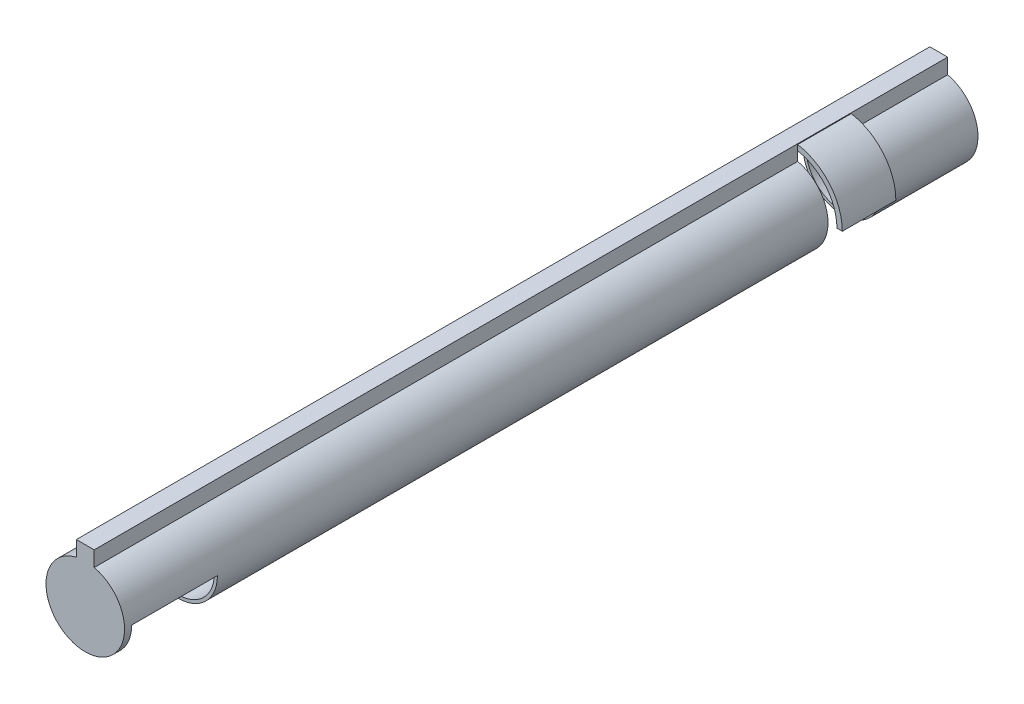
ISO-10303-21;
HEADER;
FILE_DESCRIPTION(('STEP AP214'),'2;1');
FILE_NAME('part.step','',(''),(''),'','','');
FILE_SCHEMA(('AUTOMOTIVE_DESIGN { 1 0 10303 214 1 1 1 1 }'));
ENDSEC;
DATA;
#1=APPLICATION_CONTEXT('core data for automotive mechanical design processes');
#2=APPLICATION_PROTOCOL_DEFINITION('international standard','automotive_design',2000,#1);
#3=PRODUCT_CONTEXT('',#1,'mechanical');
#4=PRODUCT('Part','Part','',(#3));
#5=PRODUCT_RELATED_PRODUCT_CATEGORY('part','',(#4));
#6=PRODUCT_DEFINITION_FORMATION('','',#4);
#7=PRODUCT_DEFINITION_CONTEXT('part definition',#1,'design');
#8=PRODUCT_DEFINITION('design','',#6,#7);
#9=PRODUCT_DEFINITION_SHAPE('','',#8);
#10=(LENGTH_UNIT() NAMED_UNIT(*) SI_UNIT(.MILLI.,.METRE.));
#11=(NAMED_UNIT(*) PLANE_ANGLE_UNIT() SI_UNIT($,.RADIAN.));
#12=(NAMED_UNIT(*) SI_UNIT($,.STERADIAN.) SOLID_ANGLE_UNIT());
#13=UNCERTAINTY_MEASURE_WITH_UNIT(LENGTH_MEASURE(1.E-05),#10,'distance_accuracy_value','');
#14=(GEOMETRIC_REPRESENTATION_CONTEXT(3) GLOBAL_UNCERTAINTY_ASSIGNED_CONTEXT((#13)) GLOBAL_UNIT_ASSIGNED_CONTEXT((#10,
#11,#12)) REPRESENTATION_CONTEXT('',''));
#15=CARTESIAN_POINT('',(0.,0.,0.));
#16=DIRECTION('',(0.,0.,1.));
#17=DIRECTION('',(1.,0.,0.));
#18=AXIS2_PLACEMENT_3D('',#15,#16,#17);
#19=CARTESIAN_POINT('',(0.,0.,213.));
#20=DIRECTION('',(0.,0.,1.));
#21=DIRECTION('',(1.,0.,0.));
#22=AXIS2_PLACEMENT_3D('',#19,#20,#21);
#23=PLANE('',#22);
#24=CARTESIAN_POINT('',(0.,0.,213.));
#25=DIRECTION('',(0.,0.,1.));
#26=DIRECTION('',(1.,0.,0.));
#27=AXIS2_PLACEMENT_3D('',#24,#25,#26);
#28=CIRCLE('',#27,6.5);
#29=CARTESIAN_POINT('',(5.50457363682691,3.45682933867876,213.));
#30=VERTEX_POINT('',#29);
#31=CARTESIAN_POINT('',(-3.45682933867876,-5.50457363682691,213.));
#32=VERTEX_POINT('',#31);
#33=EDGE_CURVE('E235',#30,#32,#28,.T.);
#34=ORIENTED_EDGE('',*,*,#33,.F.);
#35=CARTESIAN_POINT('',(12.2794334975369,7.71138852474491,213.));
#36=DIRECTION('',(0.,0.,1.));
#37=DIRECTION('',(1.,0.,0.));
#38=AXIS2_PLACEMENT_3D('',#35,#36,#37);
#39=CIRCLE('',#38,8.);
#40=CARTESIAN_POINT('',(10.15,0.,213.));
#41=VERTEX_POINT('',#40);
#42=EDGE_CURVE('E11',#30,#41,#39,.T.);
#43=ORIENTED_EDGE('',*,*,#42,.T.);
#44=CARTESIAN_POINT('',(0.,0.,213.));
#45=DIRECTION('',(0.,0.,1.));
#46=DIRECTION('',(1.,0.,0.));
#47=AXIS2_PLACEMENT_3D('',#44,#45,#46);
#48=CIRCLE('',#47,10.15);
#49=CARTESIAN_POINT('',(0.,-10.15,213.));
#50=VERTEX_POINT('',#49);
#51=EDGE_CURVE('E183',#41,#50,#48,.T.);
#52=ORIENTED_EDGE('',*,*,#51,.T.);
#53=CARTESIAN_POINT('',(-7.71138852474491,-12.2794334975369,213.));
#54=DIRECTION('',(0.,0.,1.));
#55=DIRECTION('',(1.,0.,0.));
#56=AXIS2_PLACEMENT_3D('',#53,#54,#55);
#57=CIRCLE('',#56,8.);
#58=EDGE_CURVE('E42',#50,#32,#57,.T.);
#59=ORIENTED_EDGE('',*,*,#58,.T.);
#60=EDGE_LOOP('',(#34,#43,#52,#59));
#61=FACE_BOUND('',#60,.T.);
#62=ADVANCED_FACE('F34',(#61),#23,.T.);
#63=CARTESIAN_POINT('',(0.,0.,210.));
#64=DIRECTION('',(0.,0.,-1.));
#65=DIRECTION('',(-1.,0.,0.));
#66=AXIS2_PLACEMENT_3D('',#63,#64,#65);
#67=CYLINDRICAL_SURFACE('',#66,11.);
#68=CARTESIAN_POINT('',(0.,0.,27.));
#69=DIRECTION('',(0.,0.,1.));
#70=DIRECTION('',(1.,0.,0.));
#71=AXIS2_PLACEMENT_3D('',#68,#69,#70);
#72=CIRCLE('',#71,11.);
#73=CARTESIAN_POINT('',(-2.5,10.7121426428143,27.));
#74=VERTEX_POINT('',#73);
#75=CARTESIAN_POINT('',(2.5,10.7121426428143,27.));
#76=VERTEX_POINT('',#75);
#77=EDGE_CURVE('E309',#74,#76,#72,.T.);
#78=ORIENTED_EDGE('',*,*,#77,.F.);
#79=DIRECTION('',(0.,0.,-1.));
#80=VECTOR('',#79,1.);
#81=CARTESIAN_POINT('',(-2.5,10.7121426428143,245.58678379147));
#82=LINE('',#81,#80);
#83=CARTESIAN_POINT('',(-2.5,10.7121426428143,0.));
#84=VERTEX_POINT('',#83);
#85=EDGE_CURVE('E274',#74,#84,#82,.T.);
#86=ORIENTED_EDGE('',*,*,#85,.T.);
#87=CARTESIAN_POINT('',(0.,0.,0.));
#88=DIRECTION('',(0.,0.,1.));
#89=DIRECTION('',(1.,0.,0.));
#90=AXIS2_PLACEMENT_3D('',#87,#88,#89);
#91=CIRCLE('',#90,11.);
#92=CARTESIAN_POINT('',(2.5,10.7121426428143,0.));
#93=VERTEX_POINT('',#92);
#94=EDGE_CURVE('E212',#84,#93,#91,.T.);
#95=ORIENTED_EDGE('',*,*,#94,.T.);
#96=DIRECTION('',(0.,0.,-1.));
#97=VECTOR('',#96,1.);
#98=CARTESIAN_POINT('',(2.5,10.7121426428143,245.58678379147));
#99=LINE('',#98,#97);
#100=EDGE_CURVE('E270',#76,#93,#99,.T.);
#101=ORIENTED_EDGE('',*,*,#100,.F.);
#102=EDGE_LOOP('',(#78,#86,#95,#101));
#103=FACE_BOUND('',#102,.T.);
#104=ADVANCED_FACE('F354',(#103),#67,.T.);
#105=CARTESIAN_POINT('',(0.,0.,210.));
#106=DIRECTION('',(0.,0.,-1.));
#107=DIRECTION('',(-1.,0.,0.));
#108=AXIS2_PLACEMENT_3D('',#105,#106,#107);
#109=CYLINDRICAL_SURFACE('',#108,10.15);
#110=CARTESIAN_POINT('',(0.,0.,0.));
#111=DIRECTION('',(0.,0.,1.));
#112=DIRECTION('',(1.,0.,0.));
#113=AXIS2_PLACEMENT_3D('',#110,#111,#112);
#114=CIRCLE('',#113,10.15);
#115=CARTESIAN_POINT('',(10.15,0.,0.));
#116=VERTEX_POINT('',#115);
#117=EDGE_CURVE('E205',#116,#116,#114,.T.);
#118=ORIENTED_EDGE('',*,*,#117,.F.);
#119=EDGE_LOOP('',(#118));
#120=FACE_BOUND('',#119,.T.);
#121=CARTESIAN_POINT('',(0.,0.,27.));
#122=DIRECTION('',(0.,0.,1.));
#123=DIRECTION('',(1.,0.,0.));
#124=AXIS2_PLACEMENT_3D('',#121,#122,#123);
#125=CIRCLE('',#124,10.15);
#126=CARTESIAN_POINT('',(10.15,0.,27.));
#127=VERTEX_POINT('',#126);
#128=EDGE_CURVE('E304',#127,#127,#125,.T.);
#129=ORIENTED_EDGE('',*,*,#128,.T.);
#130=EDGE_LOOP('',(#129));
#131=FACE_BOUND('',#130,.T.);
#132=ADVANCED_FACE('F359',(#120,#131),#109,.F.);
#133=DIRECTION('',(0.,0.,-1.));
#134=VECTOR('',#133,1.);
#135=CARTESIAN_POINT('',(11.,0.,237.));
#136=LINE('',#135,#134);
#137=CARTESIAN_POINT('',(11.,0.,237.));
#138=VERTEX_POINT('',#137);
#139=CARTESIAN_POINT('',(11.,0.,213.));
#140=VERTEX_POINT('',#139);
#141=EDGE_CURVE('E207',#138,#140,#136,.T.);
#142=ORIENTED_EDGE('',*,*,#141,.T.);
#143=CARTESIAN_POINT('',(0.,0.,213.));
#144=DIRECTION('',(0.,0.,1.));
#145=DIRECTION('',(1.,0.,0.));
#146=AXIS2_PLACEMENT_3D('',#143,#144,#145);
#147=CIRCLE('',#146,11.);
#148=CARTESIAN_POINT('',(0.,-11.,213.));
#149=VERTEX_POINT('',#148);
#150=EDGE_CURVE('E188',#149,#140,#147,.T.);
#151=ORIENTED_EDGE('',*,*,#150,.F.);
#152=DIRECTION('',(0.,0.,-1.));
#153=VECTOR('',#152,1.);
#154=CARTESIAN_POINT('',(0.,-11.,237.));
#155=LINE('',#154,#153);
#156=CARTESIAN_POINT('',(0.,-11.,237.));
#157=VERTEX_POINT('',#156);
#158=EDGE_CURVE('E196',#157,#149,#155,.T.);
#159=ORIENTED_EDGE('',*,*,#158,.F.);
#160=CARTESIAN_POINT('',(0.,0.,237.));
#161=DIRECTION('',(0.,0.,1.));
#162=DIRECTION('',(1.,0.,0.));
#163=AXIS2_PLACEMENT_3D('',#160,#161,#162);
#164=CIRCLE('',#163,11.);
#165=EDGE_CURVE('E242',#157,#138,#164,.T.);
#166=ORIENTED_EDGE('',*,*,#165,.T.);
#167=EDGE_LOOP('',(#142,#151,#159,#166));
#168=FACE_BOUND('',#167,.T.);
#169=CARTESIAN_POINT('',(-2.5,10.7121426428143,239.));
#170=VERTEX_POINT('',#169);
#171=CARTESIAN_POINT('',(-2.5,10.7121426428143,42.));
#172=VERTEX_POINT('',#171);
#173=EDGE_CURVE('E271',#170,#172,#82,.T.);
#174=ORIENTED_EDGE('',*,*,#173,.T.);
#175=CARTESIAN_POINT('',(0.,0.,42.));
#176=DIRECTION('',(0.,0.,1.));
#177=DIRECTION('',(1.,0.,0.));
#178=AXIS2_PLACEMENT_3D('',#175,#176,#177);
#179=CIRCLE('',#178,11.);
#180=CARTESIAN_POINT('',(2.5,10.7121426428143,42.));
#181=VERTEX_POINT('',#180);
#182=EDGE_CURVE('E301',#172,#181,#179,.T.);
#183=ORIENTED_EDGE('',*,*,#182,.T.);
#184=CARTESIAN_POINT('',(2.5,10.7121426428143,239.));
#185=VERTEX_POINT('',#184);
#186=EDGE_CURVE('E266',#185,#181,#99,.T.);
#187=ORIENTED_EDGE('',*,*,#186,.F.);
#188=CARTESIAN_POINT('',(0.,0.,239.));
#189=DIRECTION('',(0.,0.,1.));
#190=DIRECTION('',(1.,0.,0.));
#191=AXIS2_PLACEMENT_3D('',#188,#189,#190);
#192=CIRCLE('',#191,11.);
#193=EDGE_CURVE('E238',#170,#185,#192,.T.);
#194=ORIENTED_EDGE('',*,*,#193,.F.);
#195=EDGE_LOOP('',(#174,#183,#187,#194));
#196=FACE_BOUND('',#195,.T.);
#197=ADVANCED_FACE('F254',(#168,#196),#67,.T.);
#198=CARTESIAN_POINT('',(0.,0.,42.));
#199=DIRECTION('',(0.,0.,1.));
#200=DIRECTION('',(1.,0.,0.));
#201=AXIS2_PLACEMENT_3D('',#198,#199,#200);
#202=CIRCLE('',#201,10.15);
#203=CARTESIAN_POINT('',(10.15,0.,42.));
#204=VERTEX_POINT('',#203);
#205=EDGE_CURVE('E295',#204,#204,#202,.T.);
#206=ORIENTED_EDGE('',*,*,#205,.F.);
#207=EDGE_LOOP('',(#206));
#208=FACE_BOUND('',#207,.T.);
#209=CARTESIAN_POINT('',(0.,0.,210.));
#210=DIRECTION('',(0.,0.,1.));
#211=DIRECTION('',(1.,0.,0.));
#212=AXIS2_PLACEMENT_3D('',#209,#210,#211);
#213=CIRCLE('',#212,10.15);
#214=CARTESIAN_POINT('',(10.15,0.,210.));
#215=VERTEX_POINT('',#214);
#216=CARTESIAN_POINT('',(0.,-10.15,210.));
#217=VERTEX_POINT('',#216);
#218=EDGE_CURVE('E171',#215,#217,#213,.T.);
#219=ORIENTED_EDGE('',*,*,#218,.T.);
#220=DIRECTION('',(0.,0.,-1.));
#221=VECTOR('',#220,1.);
#222=CARTESIAN_POINT('',(0.,-10.15,227.354267658087));
#223=LINE('',#222,#221);
#224=EDGE_CURVE('E160',#50,#217,#223,.T.);
#225=ORIENTED_EDGE('',*,*,#224,.F.);
#226=CARTESIAN_POINT('',(0.,0.,213.));
#227=DIRECTION('',(0.,0.,1.));
#228=DIRECTION('',(1.,0.,0.));
#229=AXIS2_PLACEMENT_3D('',#226,#227,#228);
#230=CIRCLE('',#229,10.15);
#231=EDGE_CURVE('E168',#41,#50,#230,.F.);
#232=ORIENTED_EDGE('',*,*,#231,.F.);
#233=DIRECTION('',(0.,0.,-1.));
#234=VECTOR('',#233,1.);
#235=CARTESIAN_POINT('',(10.15,0.,227.354267658087));
#236=LINE('',#235,#234);
#237=EDGE_CURVE('E172',#41,#215,#236,.T.);
#238=ORIENTED_EDGE('',*,*,#237,.T.);
#239=EDGE_LOOP('',(#219,#225,#232,#238));
#240=FACE_BOUND('',#239,.T.);
#241=ADVANCED_FACE('F166',(#208,#240),#109,.F.);
#242=CARTESIAN_POINT('',(0.,0.,0.));
#243=DIRECTION('',(0.,0.,1.));
#244=DIRECTION('',(1.,0.,0.));
#245=AXIS2_PLACEMENT_3D('',#242,#243,#244);
#246=PLANE('',#245);
#247=DIRECTION('',(0.,1.,0.));
#248=VECTOR('',#247,1.);
#249=CARTESIAN_POINT('',(2.5,10.7121426428143,0.));
#250=LINE('',#249,#248);
#251=CARTESIAN_POINT('',(2.5,15.,0.));
#252=VERTEX_POINT('',#251);
#253=EDGE_CURVE('E269',#93,#252,#250,.T.);
#254=ORIENTED_EDGE('',*,*,#253,.F.);
#255=ORIENTED_EDGE('',*,*,#94,.F.);
#256=DIRECTION('',(0.,-1.,0.));
#257=VECTOR('',#256,1.);
#258=CARTESIAN_POINT('',(-2.5,10.7121426428143,0.));
#259=LINE('',#258,#257);
#260=CARTESIAN_POINT('',(-2.5,15.,0.));
#261=VERTEX_POINT('',#260);
#262=EDGE_CURVE('E277',#261,#84,#259,.T.);
#263=ORIENTED_EDGE('',*,*,#262,.F.);
#264=DIRECTION('',(-1.,0.,0.));
#265=VECTOR('',#264,1.);
#266=CARTESIAN_POINT('',(-2.5,15.,0.));
#267=LINE('',#266,#265);
#268=EDGE_CURVE('E278',#252,#261,#267,.T.);
#269=ORIENTED_EDGE('',*,*,#268,.F.);
#270=EDGE_LOOP('',(#254,#255,#263,#269));
#271=FACE_BOUND('',#270,.T.);
#272=ORIENTED_EDGE('',*,*,#117,.T.);
#273=EDGE_LOOP('',(#272));
#274=FACE_BOUND('',#273,.T.);
#275=ADVANCED_FACE('F376',(#271,#274),#246,.F.);
#276=ORIENTED_EDGE('',*,*,#51,.F.);
#277=DIRECTION('',(0.,0.,-1.));
#278=VECTOR('',#277,1.);
#279=CARTESIAN_POINT('',(10.15,0.,237.));
#280=LINE('',#279,#278);
#281=CARTESIAN_POINT('',(10.15,0.,237.));
#282=VERTEX_POINT('',#281);
#283=EDGE_CURVE('E203',#282,#41,#280,.T.);
#284=ORIENTED_EDGE('',*,*,#283,.F.);
#285=CARTESIAN_POINT('',(0.,0.,237.));
#286=DIRECTION('',(0.,0.,-1.));
#287=DIRECTION('',(-1.,0.,0.));
#288=AXIS2_PLACEMENT_3D('',#285,#286,#287);
#289=CIRCLE('',#288,10.15);
#290=CARTESIAN_POINT('',(0.,-10.15,237.));
#291=VERTEX_POINT('',#290);
#292=EDGE_CURVE('E201',#291,#282,#289,.T.);
#293=ORIENTED_EDGE('',*,*,#292,.F.);
#294=DIRECTION('',(0.,0.,-1.));
#295=VECTOR('',#294,1.);
#296=CARTESIAN_POINT('',(0.,-10.15,237.));
#297=LINE('',#296,#295);
#298=EDGE_CURVE('E193',#291,#50,#297,.T.);
#299=ORIENTED_EDGE('',*,*,#298,.T.);
#300=EDGE_LOOP('',(#276,#284,#293,#299));
#301=FACE_BOUND('',#300,.T.);
#302=ADVANCED_FACE('F199',(#301),#109,.F.);
#303=CARTESIAN_POINT('',(0.,-10.15,237.));
#304=DIRECTION('',(-1.,0.,0.));
#305=DIRECTION('',(0.,-1.,0.));
#306=AXIS2_PLACEMENT_3D('',#303,#304,#305);
#307=PLANE('',#306);
#308=ORIENTED_EDGE('',*,*,#158,.T.);
#309=DIRECTION('',(0.,1.,0.));
#310=VECTOR('',#309,1.);
#311=CARTESIAN_POINT('',(0.,-10.15,213.));
#312=LINE('',#311,#310);
#313=EDGE_CURVE('E177',#149,#50,#312,.T.);
#314=ORIENTED_EDGE('',*,*,#313,.T.);
#315=ORIENTED_EDGE('',*,*,#298,.F.);
#316=DIRECTION('',(0.,1.,0.));
#317=VECTOR('',#316,1.);
#318=CARTESIAN_POINT('',(0.,-10.15,237.));
#319=LINE('',#318,#317);
#320=EDGE_CURVE('E197',#157,#291,#319,.T.);
#321=ORIENTED_EDGE('',*,*,#320,.F.);
#322=EDGE_LOOP('',(#308,#314,#315,#321));
#323=FACE_BOUND('',#322,.T.);
#324=ADVANCED_FACE('F192',(#323),#307,.F.);
#325=CARTESIAN_POINT('',(10.15,0.,237.));
#326=DIRECTION('',(0.,1.,0.));
#327=DIRECTION('',(0.,0.,1.));
#328=AXIS2_PLACEMENT_3D('',#325,#326,#327);
#329=PLANE('',#328);
#330=ORIENTED_EDGE('',*,*,#283,.T.);
#331=DIRECTION('',(1.,0.,0.));
#332=VECTOR('',#331,1.);
#333=CARTESIAN_POINT('',(10.15,0.,213.));
#334=LINE('',#333,#332);
#335=EDGE_CURVE('E180',#41,#140,#334,.T.);
#336=ORIENTED_EDGE('',*,*,#335,.T.);
#337=ORIENTED_EDGE('',*,*,#141,.F.);
#338=DIRECTION('',(1.,0.,0.));
#339=VECTOR('',#338,1.);
#340=CARTESIAN_POINT('',(10.15,0.,237.));
#341=LINE('',#340,#339);
#342=EDGE_CURVE('E249',#282,#138,#341,.T.);
#343=ORIENTED_EDGE('',*,*,#342,.F.);
#344=EDGE_LOOP('',(#330,#336,#337,#343));
#345=FACE_BOUND('',#344,.T.);
#346=ADVANCED_FACE('F259',(#345),#329,.F.);
#347=ORIENTED_EDGE('',*,*,#231,.T.);
#348=ORIENTED_EDGE('',*,*,#313,.F.);
#349=ORIENTED_EDGE('',*,*,#150,.T.);
#350=ORIENTED_EDGE('',*,*,#335,.F.);
#351=EDGE_LOOP('',(#347,#348,#349,#350));
#352=FACE_BOUND('',#351,.T.);
#353=ADVANCED_FACE('F175',(#352),#23,.T.);
#354=CARTESIAN_POINT('',(0.,0.,210.));
#355=DIRECTION('',(0.,0.,1.));
#356=DIRECTION('',(1.,0.,0.));
#357=AXIS2_PLACEMENT_3D('',#354,#355,#356);
#358=PLANE('',#357);
#359=ORIENTED_EDGE('',*,*,#218,.F.);
#360=CARTESIAN_POINT('',(12.2794334975369,7.71138852474491,210.));
#361=DIRECTION('',(0.,0.,1.));
#362=DIRECTION('',(1.,0.,0.));
#363=AXIS2_PLACEMENT_3D('',#360,#361,#362);
#364=CIRCLE('',#363,8.);
#365=CARTESIAN_POINT('',(5.50457363682691,3.45682933867876,210.));
#366=VERTEX_POINT('',#365);
#367=EDGE_CURVE('E229',#215,#366,#364,.F.);
#368=ORIENTED_EDGE('',*,*,#367,.T.);
#369=CARTESIAN_POINT('',(0.,0.,210.));
#370=DIRECTION('',(0.,0.,1.));
#371=DIRECTION('',(1.,0.,0.));
#372=AXIS2_PLACEMENT_3D('',#369,#370,#371);
#373=CIRCLE('',#372,6.5);
#374=CARTESIAN_POINT('',(-3.45682933867876,-5.50457363682691,210.));
#375=VERTEX_POINT('',#374);
#376=EDGE_CURVE('E234',#366,#375,#373,.T.);
#377=ORIENTED_EDGE('',*,*,#376,.T.);
#378=CARTESIAN_POINT('',(-7.71138852474491,-12.2794334975369,210.));
#379=DIRECTION('',(0.,0.,1.));
#380=DIRECTION('',(1.,0.,0.));
#381=AXIS2_PLACEMENT_3D('',#378,#379,#380);
#382=CIRCLE('',#381,8.);
#383=EDGE_CURVE('E227',#375,#217,#382,.F.);
#384=ORIENTED_EDGE('',*,*,#383,.T.);
#385=EDGE_LOOP('',(#359,#368,#377,#384));
#386=FACE_BOUND('',#385,.T.);
#387=ADVANCED_FACE('F237',(#386),#358,.F.);
#388=CARTESIAN_POINT('',(0.,0.,213.));
#389=DIRECTION('',(0.,0.,-1.));
#390=DIRECTION('',(-1.,0.,0.));
#391=AXIS2_PLACEMENT_3D('',#388,#389,#390);
#392=CYLINDRICAL_SURFACE('',#391,6.5);
#393=ORIENTED_EDGE('',*,*,#376,.F.);
#394=DIRECTION('',(0.,0.,-1.));
#395=VECTOR('',#394,1.);
#396=CARTESIAN_POINT('',(5.50457363682691,3.45682933867876,213.));
#397=LINE('',#396,#395);
#398=EDGE_CURVE('E55',#366,#30,#397,.F.);
#399=ORIENTED_EDGE('',*,*,#398,.T.);
#400=ORIENTED_EDGE('',*,*,#33,.T.);
#401=DIRECTION('',(0.,0.,-1.));
#402=VECTOR('',#401,1.);
#403=CARTESIAN_POINT('',(-3.45682933867876,-5.50457363682691,213.));
#404=LINE('',#403,#402);
#405=EDGE_CURVE('E161',#32,#375,#404,.T.);
#406=ORIENTED_EDGE('',*,*,#405,.T.);
#407=EDGE_LOOP('',(#393,#399,#400,#406));
#408=FACE_BOUND('',#407,.T.);
#409=ADVANCED_FACE('F233',(#408),#392,.F.);
#410=CARTESIAN_POINT('',(0.,0.,237.));
#411=DIRECTION('',(0.,0.,1.));
#412=DIRECTION('',(1.,0.,0.));
#413=AXIS2_PLACEMENT_3D('',#410,#411,#412);
#414=PLANE('',#413);
#415=ORIENTED_EDGE('',*,*,#165,.F.);
#416=ORIENTED_EDGE('',*,*,#320,.T.);
#417=ORIENTED_EDGE('',*,*,#292,.T.);
#418=ORIENTED_EDGE('',*,*,#342,.T.);
#419=EDGE_LOOP('',(#415,#416,#417,#418));
#420=FACE_BOUND('',#419,.T.);
#421=ADVANCED_FACE('F261',(#420),#414,.F.);
#422=CARTESIAN_POINT('',(0.,0.,239.));
#423=DIRECTION('',(0.,0.,1.));
#424=DIRECTION('',(1.,0.,0.));
#425=AXIS2_PLACEMENT_3D('',#422,#423,#424);
#426=PLANE('',#425);
#427=ORIENTED_EDGE('',*,*,#193,.T.);
#428=DIRECTION('',(0.,1.,0.));
#429=VECTOR('',#428,1.);
#430=CARTESIAN_POINT('',(2.5,10.7121426428143,239.));
#431=LINE('',#430,#429);
#432=CARTESIAN_POINT('',(2.5,15.,239.));
#433=VERTEX_POINT('',#432);
#434=EDGE_CURVE('E282',#185,#433,#431,.T.);
#435=ORIENTED_EDGE('',*,*,#434,.T.);
#436=DIRECTION('',(-1.,0.,0.));
#437=VECTOR('',#436,1.);
#438=CARTESIAN_POINT('',(-2.5,15.,239.));
#439=LINE('',#438,#437);
#440=CARTESIAN_POINT('',(-2.5,15.,239.));
#441=VERTEX_POINT('',#440);
#442=EDGE_CURVE('E263',#433,#441,#439,.T.);
#443=ORIENTED_EDGE('',*,*,#442,.T.);
#444=DIRECTION('',(0.,-1.,0.));
#445=VECTOR('',#444,1.);
#446=CARTESIAN_POINT('',(-2.5,10.7121426428143,239.));
#447=LINE('',#446,#445);
#448=EDGE_CURVE('E262',#441,#170,#447,.T.);
#449=ORIENTED_EDGE('',*,*,#448,.T.);
#450=EDGE_LOOP('',(#427,#435,#443,#449));
#451=FACE_BOUND('',#450,.T.);
#452=ADVANCED_FACE('F452',(#451),#426,.T.);
#453=CARTESIAN_POINT('',(-2.5,15.,245.58678379147));
#454=DIRECTION('',(0.,-1.,0.));
#455=DIRECTION('',(0.,0.,-1.));
#456=AXIS2_PLACEMENT_3D('',#453,#454,#455);
#457=PLANE('',#456);
#458=ORIENTED_EDGE('',*,*,#442,.F.);
#459=DIRECTION('',(0.,0.,-1.));
#460=VECTOR('',#459,1.);
#461=CARTESIAN_POINT('',(2.5,15.,245.58678379147));
#462=LINE('',#461,#460);
#463=EDGE_CURVE('E279',#433,#252,#462,.T.);
#464=ORIENTED_EDGE('',*,*,#463,.T.);
#465=ORIENTED_EDGE('',*,*,#268,.T.);
#466=DIRECTION('',(0.,0.,-1.));
#467=VECTOR('',#466,1.);
#468=CARTESIAN_POINT('',(-2.5,15.,245.58678379147));
#469=LINE('',#468,#467);
#470=EDGE_CURVE('E275',#441,#261,#469,.T.);
#471=ORIENTED_EDGE('',*,*,#470,.F.);
#472=EDGE_LOOP('',(#458,#464,#465,#471));
#473=FACE_BOUND('',#472,.T.);
#474=ADVANCED_FACE('F449',(#473),#457,.F.);
#475=CARTESIAN_POINT('',(-2.5,10.7121426428143,245.58678379147));
#476=DIRECTION('',(1.,0.,0.));
#477=DIRECTION('',(0.,0.,-1.));
#478=AXIS2_PLACEMENT_3D('',#475,#476,#477);
#479=PLANE('',#478);
#480=DIRECTION('',(0.,0.,-1.));
#481=VECTOR('',#480,1.);
#482=CARTESIAN_POINT('',(-2.5,13.2664991614216,42.));
#483=LINE('',#482,#481);
#484=CARTESIAN_POINT('',(-2.5,13.2664991614216,42.));
#485=VERTEX_POINT('',#484);
#486=CARTESIAN_POINT('',(-2.5,13.2664991614216,27.));
#487=VERTEX_POINT('',#486);
#488=EDGE_CURVE('E281',#485,#487,#483,.T.);
#489=ORIENTED_EDGE('',*,*,#488,.F.);
#490=DIRECTION('',(0.,-1.,0.));
#491=VECTOR('',#490,1.);
#492=CARTESIAN_POINT('',(-2.5,10.7121426428143,42.));
#493=LINE('',#492,#491);
#494=EDGE_CURVE('E298',#485,#172,#493,.T.);
#495=ORIENTED_EDGE('',*,*,#494,.T.);
#496=ORIENTED_EDGE('',*,*,#173,.F.);
#497=ORIENTED_EDGE('',*,*,#448,.F.);
#498=ORIENTED_EDGE('',*,*,#470,.T.);
#499=ORIENTED_EDGE('',*,*,#262,.T.);
#500=ORIENTED_EDGE('',*,*,#85,.F.);
#501=DIRECTION('',(0.,-1.,0.));
#502=VECTOR('',#501,1.);
#503=CARTESIAN_POINT('',(-2.5,10.7121426428143,27.));
#504=LINE('',#503,#502);
#505=EDGE_CURVE('E307',#487,#74,#504,.T.);
#506=ORIENTED_EDGE('',*,*,#505,.F.);
#507=EDGE_LOOP('',(#489,#495,#496,#497,#498,#499,#500,#506));
#508=FACE_BOUND('',#507,.T.);
#509=ADVANCED_FACE('F406',(#508),#479,.F.);
#510=CARTESIAN_POINT('',(2.5,10.7121426428143,245.58678379147));
#511=DIRECTION('',(-1.,0.,0.));
#512=DIRECTION('',(0.,0.,1.));
#513=AXIS2_PLACEMENT_3D('',#510,#511,#512);
#514=PLANE('',#513);
#515=DIRECTION('',(0.,1.,0.));
#516=VECTOR('',#515,1.);
#517=CARTESIAN_POINT('',(2.5,10.7121426428143,42.));
#518=LINE('',#517,#516);
#519=CARTESIAN_POINT('',(2.5,13.2664991614216,42.));
#520=VERTEX_POINT('',#519);
#521=EDGE_CURVE('E221',#181,#520,#518,.T.);
#522=ORIENTED_EDGE('',*,*,#521,.T.);
#523=DIRECTION('',(0.,1.,0.));
#524=VECTOR('',#523,1.);
#525=CARTESIAN_POINT('',(2.5,10.7121426428143,42.));
#526=LINE('',#525,#524);
#527=CARTESIAN_POINT('',(2.5,14.790199457749,42.));
#528=VERTEX_POINT('',#527);
#529=EDGE_CURVE('E314',#520,#528,#526,.T.);
#530=ORIENTED_EDGE('',*,*,#529,.T.);
#531=DIRECTION('',(0.,0.,-1.));
#532=VECTOR('',#531,1.);
#533=CARTESIAN_POINT('',(2.5,14.790199457749,42.));
#534=LINE('',#533,#532);
#535=CARTESIAN_POINT('',(2.5,14.790199457749,27.));
#536=VERTEX_POINT('',#535);
#537=EDGE_CURVE('E224',#536,#528,#534,.F.);
#538=ORIENTED_EDGE('',*,*,#537,.F.);
#539=DIRECTION('',(0.,1.,0.));
#540=VECTOR('',#539,1.);
#541=CARTESIAN_POINT('',(2.5,10.7121426428143,27.));
#542=LINE('',#541,#540);
#543=CARTESIAN_POINT('',(2.5,13.2664991614216,27.));
#544=VERTEX_POINT('',#543);
#545=EDGE_CURVE('E317',#544,#536,#542,.T.);
#546=ORIENTED_EDGE('',*,*,#545,.F.);
#547=DIRECTION('',(0.,1.,0.));
#548=VECTOR('',#547,1.);
#549=CARTESIAN_POINT('',(2.5,10.7121426428143,27.));
#550=LINE('',#549,#548);
#551=EDGE_CURVE('E218',#76,#544,#550,.T.);
#552=ORIENTED_EDGE('',*,*,#551,.F.);
#553=ORIENTED_EDGE('',*,*,#100,.T.);
#554=ORIENTED_EDGE('',*,*,#253,.T.);
#555=ORIENTED_EDGE('',*,*,#463,.F.);
#556=ORIENTED_EDGE('',*,*,#434,.F.);
#557=ORIENTED_EDGE('',*,*,#186,.T.);
#558=EDGE_LOOP('',(#522,#530,#538,#546,#552,#553,#554,#555,#556,#557));
#559=FACE_BOUND('',#558,.T.);
#560=ADVANCED_FACE('F414',(#559),#514,.F.);
#561=CARTESIAN_POINT('',(0.,0.,42.));
#562=DIRECTION('',(0.,0.,-1.));
#563=DIRECTION('',(-1.,0.,0.));
#564=AXIS2_PLACEMENT_3D('',#561,#562,#563);
#565=CYLINDRICAL_SURFACE('',#564,13.5);
#566=CARTESIAN_POINT('',(0.,0.,42.));
#567=DIRECTION('',(0.,0.,1.));
#568=DIRECTION('',(1.,0.,0.));
#569=AXIS2_PLACEMENT_3D('',#566,#567,#568);
#570=CIRCLE('',#569,13.5);
#571=EDGE_CURVE('E311',#520,#485,#570,.T.);
#572=ORIENTED_EDGE('',*,*,#571,.T.);
#573=ORIENTED_EDGE('',*,*,#488,.T.);
#574=CARTESIAN_POINT('',(0.,0.,27.));
#575=DIRECTION('',(0.,0.,1.));
#576=DIRECTION('',(1.,0.,0.));
#577=AXIS2_PLACEMENT_3D('',#574,#575,#576);
#578=CIRCLE('',#577,13.5);
#579=EDGE_CURVE('E312',#544,#487,#578,.T.);
#580=ORIENTED_EDGE('',*,*,#579,.F.);
#581=CARTESIAN_POINT('',(0.,0.,27.));
#582=DIRECTION('',(0.,0.,-1.));
#583=DIRECTION('',(1.,0.,0.));
#584=AXIS2_PLACEMENT_3D('',#581,#582,#583);
#585=CIRCLE('',#584,13.5);
#586=CARTESIAN_POINT('',(13.5,0.,27.));
#587=VERTEX_POINT('',#586);
#588=EDGE_CURVE('E333',#544,#587,#585,.T.);
#589=ORIENTED_EDGE('',*,*,#588,.T.);
#590=DIRECTION('',(0.,0.,-1.));
#591=VECTOR('',#590,1.);
#592=CARTESIAN_POINT('',(13.5,0.,42.));
#593=LINE('',#592,#591);
#594=CARTESIAN_POINT('',(13.5,0.,42.));
#595=VERTEX_POINT('',#594);
#596=EDGE_CURVE('E320',#595,#587,#593,.T.);
#597=ORIENTED_EDGE('',*,*,#596,.F.);
#598=CARTESIAN_POINT('',(0.,0.,42.));
#599=DIRECTION('',(0.,0.,-1.));
#600=DIRECTION('',(1.,0.,0.));
#601=AXIS2_PLACEMENT_3D('',#598,#599,#600);
#602=CIRCLE('',#601,13.5);
#603=EDGE_CURVE('E330',#520,#595,#602,.T.);
#604=ORIENTED_EDGE('',*,*,#603,.F.);
#605=EDGE_LOOP('',(#572,#573,#580,#589,#597,#604));
#606=FACE_BOUND('',#605,.T.);
#607=ADVANCED_FACE('F418',(#606),#565,.F.);
#608=CARTESIAN_POINT('',(0.,0.,42.));
#609=DIRECTION('',(0.,0.,1.));
#610=DIRECTION('',(1.,0.,0.));
#611=AXIS2_PLACEMENT_3D('',#608,#609,#610);
#612=PLANE('',#611);
#613=ORIENTED_EDGE('',*,*,#205,.T.);
#614=EDGE_LOOP('',(#613));
#615=FACE_BOUND('',#614,.T.);
#616=ORIENTED_EDGE('',*,*,#571,.F.);
#617=ORIENTED_EDGE('',*,*,#521,.F.);
#618=ORIENTED_EDGE('',*,*,#182,.F.);
#619=ORIENTED_EDGE('',*,*,#494,.F.);
#620=EDGE_LOOP('',(#616,#617,#618,#619));
#621=FACE_BOUND('',#620,.T.);
#622=ADVANCED_FACE('F396',(#615,#621),#612,.F.);
#623=CARTESIAN_POINT('',(0.,0.,27.));
#624=DIRECTION('',(0.,0.,1.));
#625=DIRECTION('',(1.,0.,0.));
#626=AXIS2_PLACEMENT_3D('',#623,#624,#625);
#627=PLANE('',#626);
#628=ORIENTED_EDGE('',*,*,#128,.F.);
#629=EDGE_LOOP('',(#628));
#630=FACE_BOUND('',#629,.T.);
#631=ORIENTED_EDGE('',*,*,#505,.T.);
#632=ORIENTED_EDGE('',*,*,#77,.T.);
#633=ORIENTED_EDGE('',*,*,#551,.T.);
#634=ORIENTED_EDGE('',*,*,#579,.T.);
#635=EDGE_LOOP('',(#631,#632,#633,#634));
#636=FACE_BOUND('',#635,.T.);
#637=ADVANCED_FACE('F392',(#630,#636),#627,.T.);
#638=CARTESIAN_POINT('',(0.,0.,42.));
#639=DIRECTION('',(0.,0.,-1.));
#640=DIRECTION('',(-1.,0.,0.));
#641=AXIS2_PLACEMENT_3D('',#638,#639,#640);
#642=CYLINDRICAL_SURFACE('',#641,15.);
#643=CARTESIAN_POINT('',(0.,0.,27.));
#644=DIRECTION('',(0.,0.,1.));
#645=DIRECTION('',(-1.,0.,0.));
#646=AXIS2_PLACEMENT_3D('',#643,#644,#645);
#647=CIRCLE('',#646,15.);
#648=CARTESIAN_POINT('',(15.,0.,27.));
#649=VERTEX_POINT('',#648);
#650=EDGE_CURVE('E327',#649,#536,#647,.T.);
#651=ORIENTED_EDGE('',*,*,#650,.T.);
#652=ORIENTED_EDGE('',*,*,#537,.T.);
#653=CARTESIAN_POINT('',(0.,0.,42.));
#654=DIRECTION('',(0.,0.,1.));
#655=DIRECTION('',(-1.,0.,0.));
#656=AXIS2_PLACEMENT_3D('',#653,#654,#655);
#657=CIRCLE('',#656,15.);
#658=CARTESIAN_POINT('',(15.,0.,42.));
#659=VERTEX_POINT('',#658);
#660=EDGE_CURVE('E326',#659,#528,#657,.T.);
#661=ORIENTED_EDGE('',*,*,#660,.F.);
#662=DIRECTION('',(0.,0.,-1.));
#663=VECTOR('',#662,1.);
#664=CARTESIAN_POINT('',(15.,0.,42.));
#665=LINE('',#664,#663);
#666=EDGE_CURVE('E323',#659,#649,#665,.T.);
#667=ORIENTED_EDGE('',*,*,#666,.T.);
#668=EDGE_LOOP('',(#651,#652,#661,#667));
#669=FACE_BOUND('',#668,.T.);
#670=ADVANCED_FACE('F395',(#669),#642,.T.);
#671=CARTESIAN_POINT('',(0.,0.,42.));
#672=DIRECTION('',(0.,0.,1.));
#673=DIRECTION('',(1.,0.,0.));
#674=AXIS2_PLACEMENT_3D('',#671,#672,#673);
#675=PLANE('',#674);
#676=ORIENTED_EDGE('',*,*,#529,.F.);
#677=ORIENTED_EDGE('',*,*,#603,.T.);
#678=DIRECTION('',(1.,0.,0.));
#679=VECTOR('',#678,1.);
#680=CARTESIAN_POINT('',(13.5,0.,42.));
#681=LINE('',#680,#679);
#682=EDGE_CURVE('E337',#595,#659,#681,.T.);
#683=ORIENTED_EDGE('',*,*,#682,.T.);
#684=ORIENTED_EDGE('',*,*,#660,.T.);
#685=EDGE_LOOP('',(#676,#677,#683,#684));
#686=FACE_BOUND('',#685,.T.);
#687=ADVANCED_FACE('F429',(#686),#675,.T.);
#688=CARTESIAN_POINT('',(0.,0.,27.));
#689=DIRECTION('',(0.,0.,1.));
#690=DIRECTION('',(1.,0.,0.));
#691=AXIS2_PLACEMENT_3D('',#688,#689,#690);
#692=PLANE('',#691);
#693=ORIENTED_EDGE('',*,*,#588,.F.);
#694=ORIENTED_EDGE('',*,*,#545,.T.);
#695=ORIENTED_EDGE('',*,*,#650,.F.);
#696=DIRECTION('',(1.,0.,0.));
#697=VECTOR('',#696,1.);
#698=CARTESIAN_POINT('',(13.5,0.,27.));
#699=LINE('',#698,#697);
#700=EDGE_CURVE('E331',#587,#649,#699,.T.);
#701=ORIENTED_EDGE('',*,*,#700,.F.);
#702=EDGE_LOOP('',(#693,#694,#695,#701));
#703=FACE_BOUND('',#702,.T.);
#704=ADVANCED_FACE('F349',(#703),#692,.F.);
#705=CARTESIAN_POINT('',(13.5,0.,42.));
#706=DIRECTION('',(0.,1.,0.));
#707=DIRECTION('',(0.,0.,1.));
#708=AXIS2_PLACEMENT_3D('',#705,#706,#707);
#709=PLANE('',#708);
#710=ORIENTED_EDGE('',*,*,#700,.T.);
#711=ORIENTED_EDGE('',*,*,#666,.F.);
#712=ORIENTED_EDGE('',*,*,#682,.F.);
#713=ORIENTED_EDGE('',*,*,#596,.T.);
#714=EDGE_LOOP('',(#710,#711,#712,#713));
#715=FACE_BOUND('',#714,.T.);
#716=ADVANCED_FACE('F344',(#715),#709,.F.);
#717=CARTESIAN_POINT('',(12.2794334975369,7.71138852474491,213.));
#718=DIRECTION('',(0.,0.,-1.));
#719=DIRECTION('',(-1.,0.,0.));
#720=AXIS2_PLACEMENT_3D('',#717,#718,#719);
#721=CYLINDRICAL_SURFACE('',#720,8.);
#722=ORIENTED_EDGE('',*,*,#42,.F.);
#723=ORIENTED_EDGE('',*,*,#398,.F.);
#724=ORIENTED_EDGE('',*,*,#367,.F.);
#725=ORIENTED_EDGE('',*,*,#237,.F.);
#726=EDGE_LOOP('',(#722,#723,#724,#725));
#727=FACE_BOUND('',#726,.T.);
#728=ADVANCED_FACE('F342',(#727),#721,.T.);
#729=CARTESIAN_POINT('',(-7.71138852474491,-12.2794334975369,213.));
#730=DIRECTION('',(0.,0.,1.));
#731=DIRECTION('',(1.,0.,0.));
#732=AXIS2_PLACEMENT_3D('',#729,#730,#731);
#733=CYLINDRICAL_SURFACE('',#732,8.);
#734=ORIENTED_EDGE('',*,*,#383,.F.);
#735=ORIENTED_EDGE('',*,*,#405,.F.);
#736=ORIENTED_EDGE('',*,*,#58,.F.);
#737=ORIENTED_EDGE('',*,*,#224,.T.);
#738=EDGE_LOOP('',(#734,#735,#736,#737));
#739=FACE_BOUND('',#738,.T.);
#740=ADVANCED_FACE('F36',(#739),#733,.T.);
#741=CLOSED_SHELL('',(#62,#104,#132,#197,#241,#275,#302,#324,#346,#353,#387,#409,#421,#452,#474,
#509,#560,#607,#622,#637,#670,#687,#704,#716,#728,#740));
#742=MANIFOLD_SOLID_BREP('B2',#741);
#743=ADVANCED_BREP_SHAPE_REPRESENTATION('',(#18,#742),#14);
#744=SHAPE_DEFINITION_REPRESENTATION(#9,#743);
ENDSEC;
END-ISO-10303-21;
